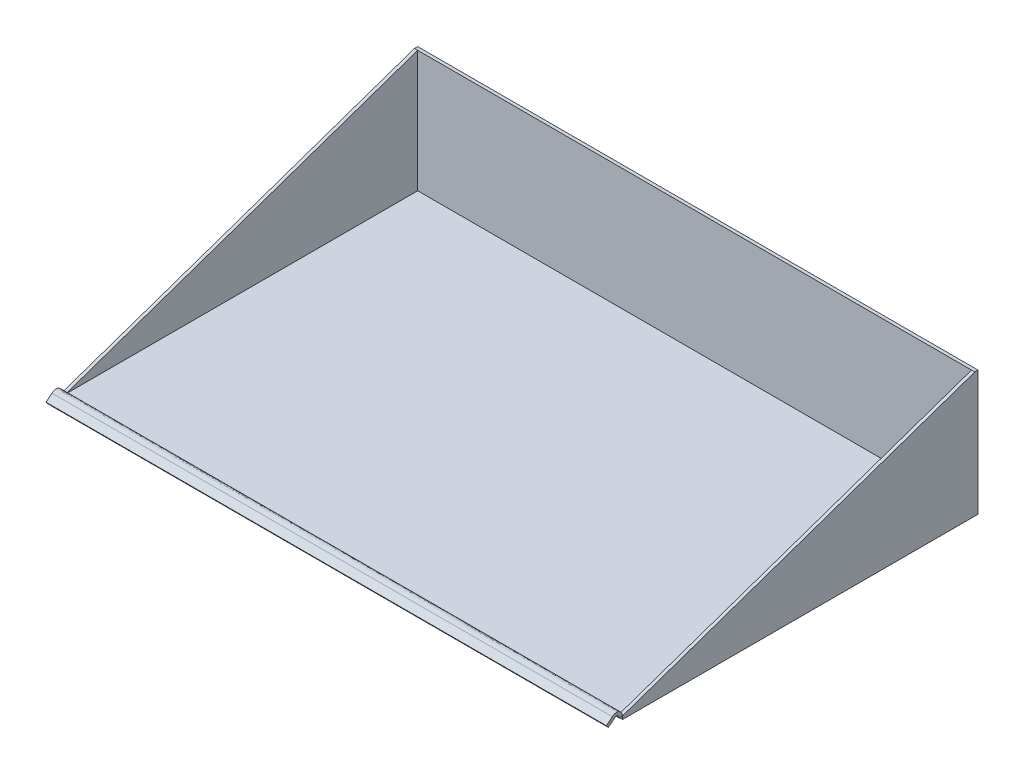
ISO-10303-21;
HEADER;
FILE_DESCRIPTION(('STEP AP214'),'2;1');
FILE_NAME('part.step','',(''),(''),'','','');
FILE_SCHEMA(('AUTOMOTIVE_DESIGN { 1 0 10303 214 1 1 1 1 }'));
ENDSEC;
DATA;
#1=APPLICATION_CONTEXT('core data for automotive mechanical design processes');
#2=APPLICATION_PROTOCOL_DEFINITION('international standard','automotive_design',2000,#1);
#3=PRODUCT_CONTEXT('',#1,'mechanical');
#4=PRODUCT('Part','Part','',(#3));
#5=PRODUCT_RELATED_PRODUCT_CATEGORY('part','',(#4));
#6=PRODUCT_DEFINITION_FORMATION('','',#4);
#7=PRODUCT_DEFINITION_CONTEXT('part definition',#1,'design');
#8=PRODUCT_DEFINITION('design','',#6,#7);
#9=PRODUCT_DEFINITION_SHAPE('','',#8);
#10=(LENGTH_UNIT() NAMED_UNIT(*) SI_UNIT(.MILLI.,.METRE.));
#11=(NAMED_UNIT(*) PLANE_ANGLE_UNIT() SI_UNIT($,.RADIAN.));
#12=(NAMED_UNIT(*) SI_UNIT($,.STERADIAN.) SOLID_ANGLE_UNIT());
#13=UNCERTAINTY_MEASURE_WITH_UNIT(LENGTH_MEASURE(1.E-05),#10,'distance_accuracy_value','');
#14=(GEOMETRIC_REPRESENTATION_CONTEXT(3) GLOBAL_UNCERTAINTY_ASSIGNED_CONTEXT((#13)) GLOBAL_UNIT_ASSIGNED_CONTEXT((#10,
#11,#12)) REPRESENTATION_CONTEXT('',''));
#15=CARTESIAN_POINT('',(0.,0.,0.));
#16=DIRECTION('',(0.,0.,1.));
#17=DIRECTION('',(1.,0.,0.));
#18=AXIS2_PLACEMENT_3D('',#15,#16,#17);
#19=CARTESIAN_POINT('',(874.999030268134,-186.553060223373,1119.87866407682));
#20=CARTESIAN_POINT('',(874.999030268134,-185.33767047569,1120.06973985977));
#21=CARTESIAN_POINT('',(874.999030268134,-184.188767651149,1120.3794168465));
#22=CARTESIAN_POINT('',(874.999030268134,-182.088320689779,1121.1802260065));
#23=CARTESIAN_POINT('',(874.999030268134,-181.137567773144,1121.67135685643));
#24=CARTESIAN_POINT('',(874.999030268134,-179.489339069219,1122.75910040641));
#25=CARTESIAN_POINT('',(874.999030268134,-178.792882476305,1123.35478820171));
#26=CARTESIAN_POINT('',(874.999030268134,-177.671721163025,1124.56585322124));
#27=CARTESIAN_POINT('',(874.999030268134,-177.246987467464,1125.17864895372));
#28=CARTESIAN_POINT('',(874.999030268134,-176.782949501282,1126.07897587323));
#29=CARTESIAN_POINT('',(874.999030268134,-176.656608706155,1126.3765701471));
#30=CARTESIAN_POINT('',(874.999030268134,-176.453314872512,1126.97256389413));
#31=CARTESIAN_POINT('',(874.999030268134,-176.37619538104,1127.27099206625));
#32=CARTESIAN_POINT('',(874.999030268134,-176.267470575038,1127.8831959906));
#33=CARTESIAN_POINT('',(874.999030268134,-176.235735175897,1128.19712639057));
#34=CARTESIAN_POINT('',(874.999030268134,-176.22237280719,1128.86101090105));
#35=CARTESIAN_POINT('',(874.999030268134,-176.240740952856,1129.21118582822));
#36=CARTESIAN_POINT('',(874.999030268134,-176.342967965615,1129.96841319844));
#37=CARTESIAN_POINT('',(874.999030268134,-176.426954175793,1130.37563359115));
#38=CARTESIAN_POINT('',(874.999030268134,-176.684670954285,1131.26169017919));
#39=CARTESIAN_POINT('',(874.999030268134,-176.858576959705,1131.74056755363));
#40=CARTESIAN_POINT('',(874.999030268134,-177.557226077684,1133.29255868625));
#41=CARTESIAN_POINT('',(874.999030268134,-178.261229014839,1134.48391313188));
#42=CARTESIAN_POINT('',(874.999030268134,-179.304280989804,1135.80511230017));
#43=B_SPLINE_CURVE_WITH_KNOTS('',3,(#19,#20,#21,#22,#23,#24,#25,#26,#27,#28,#29,#30,#31,#32,#33,
#34,#35,#36,#37,#38,#39,#40,#41,#42),.UNSPECIFIED.,.F.,.F.,(4,2,2,2,2,2,2,2,2,2,2,4),(0.,0.125,
0.25,0.375,0.499999999999999,0.562499999999999,0.624999999999999,0.687499999999999,
0.749999999999999,0.812499999999999,0.874999999999999,1.),.UNSPECIFIED.);
#44=DIRECTION('',(-1.,0.,0.));
#45=VECTOR('',#44,1.);
#46=SURFACE_OF_LINEAR_EXTRUSION('',#43,#45);
#47=DIRECTION('',(-1.,0.,0.));
#48=VECTOR('',#47,1.);
#49=CARTESIAN_POINT('',(874.999030268134,-179.304280989804,1135.80511230017));
#50=LINE('',#49,#48);
#51=CARTESIAN_POINT('',(874.999030268134,-179.304280989804,1135.80511230017));
#52=VERTEX_POINT('',#51);
#53=CARTESIAN_POINT('',(-875.,-179.304280989804,1135.80511230017));
#54=VERTEX_POINT('',#53);
#55=EDGE_CURVE('E47',#52,#54,#50,.T.);
#56=ORIENTED_EDGE('',*,*,#55,.T.);
#57=CARTESIAN_POINT('',(-875.,-186.553060223373,1119.87866407682));
#58=CARTESIAN_POINT('',(-875.,-185.33767047569,1120.06973985977));
#59=CARTESIAN_POINT('',(-875.,-184.188767651149,1120.3794168465));
#60=CARTESIAN_POINT('',(-875.,-182.088320689779,1121.1802260065));
#61=CARTESIAN_POINT('',(-875.,-181.137567773144,1121.67135685643));
#62=CARTESIAN_POINT('',(-875.,-179.489339069219,1122.75910040641));
#63=CARTESIAN_POINT('',(-875.,-178.792882476305,1123.35478820171));
#64=CARTESIAN_POINT('',(-875.,-177.671721163025,1124.56585322124));
#65=CARTESIAN_POINT('',(-875.,-177.246987467464,1125.17864895372));
#66=CARTESIAN_POINT('',(-875.,-176.782949501282,1126.07897587323));
#67=CARTESIAN_POINT('',(-875.,-176.656608706155,1126.3765701471));
#68=CARTESIAN_POINT('',(-875.,-176.453314872512,1126.97256389413));
#69=CARTESIAN_POINT('',(-875.,-176.37619538104,1127.27099206625));
#70=CARTESIAN_POINT('',(-875.,-176.267470575038,1127.8831959906));
#71=CARTESIAN_POINT('',(-875.,-176.235735175897,1128.19712639057));
#72=CARTESIAN_POINT('',(-875.,-176.22237280719,1128.86101090105));
#73=CARTESIAN_POINT('',(-875.,-176.240740952856,1129.21118582822));
#74=CARTESIAN_POINT('',(-875.,-176.342967965615,1129.96841319844));
#75=CARTESIAN_POINT('',(-875.,-176.426954175793,1130.37563359115));
#76=CARTESIAN_POINT('',(-875.,-176.684670954285,1131.26169017919));
#77=CARTESIAN_POINT('',(-875.,-176.858576959705,1131.74056755363));
#78=CARTESIAN_POINT('',(-875.,-177.557226077684,1133.29255868625));
#79=CARTESIAN_POINT('',(-875.,-178.261229014839,1134.48391313188));
#80=CARTESIAN_POINT('',(-875.,-179.304280989804,1135.80511230017));
#81=B_SPLINE_CURVE_WITH_KNOTS('',3,(#57,#58,#59,#60,#61,#62,#63,#64,#65,#66,#67,#68,#69,#70,#71,
#72,#73,#74,#75,#76,#77,#78,#79,#80),.UNSPECIFIED.,.F.,.F.,(4,2,2,2,2,2,2,2,2,2,2,4),(0.,0.125,
0.25,0.375,0.499999999999999,0.562499999999999,0.624999999999999,0.687499999999999,
0.749999999999999,0.812499999999999,0.874999999999999,1.),.UNSPECIFIED.);
#82=CARTESIAN_POINT('',(-875.,-186.553060223373,1119.87866407682));
#83=VERTEX_POINT('',#82);
#84=EDGE_CURVE('E121',#83,#54,#81,.T.);
#85=ORIENTED_EDGE('',*,*,#84,.F.);
#86=DIRECTION('',(-1.,0.,0.));
#87=VECTOR('',#86,1.);
#88=CARTESIAN_POINT('',(874.999030268134,-186.553060223373,1119.87866407682));
#89=LINE('',#88,#87);
#90=CARTESIAN_POINT('',(874.999030268134,-186.553060223373,1119.87866407682));
#91=VERTEX_POINT('',#90);
#92=EDGE_CURVE('E12',#91,#83,#89,.T.);
#93=ORIENTED_EDGE('',*,*,#92,.F.);
#94=EDGE_CURVE('E142',#91,#52,#43,.T.);
#95=ORIENTED_EDGE('',*,*,#94,.T.);
#96=EDGE_LOOP('',(#56,#85,#93,#95));
#97=FACE_BOUND('',#96,.T.);
#98=ADVANCED_FACE('F43',(#97),#46,.T.);
#99=CARTESIAN_POINT('',(874.999030268134,-186.553060223373,1119.87866407682));
#100=DIRECTION('',(0.,0.987866407681604,0.155306022337329));
#101=DIRECTION('',(0.,-0.155306022337329,0.987866407681604));
#102=AXIS2_PLACEMENT_3D('',#99,#100,#101);
#103=PLANE('',#102);
#104=ORIENTED_EDGE('',*,*,#92,.T.);
#105=DIRECTION('',(0.,0.155306022337329,-0.987866407681604));
#106=VECTOR('',#105,1.);
#107=CARTESIAN_POINT('',(-875.,-186.553060223373,1119.87866407682));
#108=LINE('',#107,#106);
#109=CARTESIAN_POINT('',(-875.,-185.,1110.));
#110=VERTEX_POINT('',#109);
#111=EDGE_CURVE('E137',#83,#110,#108,.T.);
#112=ORIENTED_EDGE('',*,*,#111,.T.);
#113=DIRECTION('',(-1.,0.,0.));
#114=VECTOR('',#113,1.);
#115=CARTESIAN_POINT('',(874.999030268134,-185.,1110.));
#116=LINE('',#115,#114);
#117=CARTESIAN_POINT('',(874.999030268134,-185.,1110.));
#118=VERTEX_POINT('',#117);
#119=EDGE_CURVE('E52',#118,#110,#116,.T.);
#120=ORIENTED_EDGE('',*,*,#119,.F.);
#121=DIRECTION('',(0.,0.155306022337329,-0.987866407681604));
#122=VECTOR('',#121,1.);
#123=CARTESIAN_POINT('',(874.999030268134,-186.553060223373,1119.87866407682));
#124=LINE('',#123,#122);
#125=EDGE_CURVE('E65',#91,#118,#124,.T.);
#126=ORIENTED_EDGE('',*,*,#125,.F.);
#127=EDGE_LOOP('',(#104,#112,#120,#126));
#128=FACE_BOUND('',#127,.T.);
#129=ADVANCED_FACE('F162',(#128),#103,.F.);
#130=CARTESIAN_POINT('',(874.999030268134,-185.,1110.));
#131=CARTESIAN_POINT('',(874.999030268134,-169.848941356738,1112.38195229009));
#132=CARTESIAN_POINT('',(874.999030268134,-159.462762779071,1126.81081381579));
#133=CARTESIAN_POINT('',(874.999030268134,-171.45545333447,1142.00155518596));
#134=B_SPLINE_CURVE_WITH_KNOTS('',3,(#130,#131,#132,#133),.UNSPECIFIED.,.F.,.F.,(4,4),(0.,1.),.UNSPECIFIED.);
#135=DIRECTION('',(-1.,0.,0.));
#136=VECTOR('',#135,1.);
#137=SURFACE_OF_LINEAR_EXTRUSION('',#134,#136);
#138=ORIENTED_EDGE('',*,*,#119,.T.);
#139=CARTESIAN_POINT('',(-875.,-185.,1110.));
#140=CARTESIAN_POINT('',(-875.,-169.848941356738,1112.38195229009));
#141=CARTESIAN_POINT('',(-875.,-159.462762779071,1126.81081381579));
#142=CARTESIAN_POINT('',(-875.,-171.45545333447,1142.00155518596));
#143=B_SPLINE_CURVE_WITH_KNOTS('',3,(#139,#140,#141,#142),.UNSPECIFIED.,.F.,.F.,(4,4),(0.,1.),.UNSPECIFIED.);
#144=CARTESIAN_POINT('',(-875.,-171.45545333447,1142.00155518596));
#145=VERTEX_POINT('',#144);
#146=EDGE_CURVE('E123',#110,#145,#143,.T.);
#147=ORIENTED_EDGE('',*,*,#146,.T.);
#148=DIRECTION('',(-1.,0.,0.));
#149=VECTOR('',#148,1.);
#150=CARTESIAN_POINT('',(874.999030268134,-171.45545333447,1142.00155518596));
#151=LINE('',#150,#149);
#152=CARTESIAN_POINT('',(874.999030268134,-171.45545333447,1142.00155518596));
#153=VERTEX_POINT('',#152);
#154=EDGE_CURVE('E120',#153,#145,#151,.T.);
#155=ORIENTED_EDGE('',*,*,#154,.F.);
#156=EDGE_CURVE('E147',#118,#153,#134,.T.);
#157=ORIENTED_EDGE('',*,*,#156,.F.);
#158=EDGE_LOOP('',(#138,#147,#155,#157));
#159=FACE_BOUND('',#158,.T.);
#160=ADVANCED_FACE('F158',(#159),#137,.F.);
#161=CARTESIAN_POINT('',(874.999030268134,-176.937628823343,1125.77886690006));
#162=DIRECTION('',(-1.,0.,0.));
#163=DIRECTION('',(0.,0.,1.));
#164=AXIS2_PLACEMENT_3D('',#161,#162,#163);
#165=PLANE('',#164);
#166=ORIENTED_EDGE('',*,*,#94,.F.);
#167=ORIENTED_EDGE('',*,*,#125,.T.);
#168=ORIENTED_EDGE('',*,*,#156,.T.);
#169=DIRECTION('',(0.,0.619644288579017,-0.784882765533429));
#170=VECTOR('',#169,1.);
#171=CARTESIAN_POINT('',(874.999030268134,-186.35472510417,1160.87396609425));
#172=LINE('',#171,#170);
#173=CARTESIAN_POINT('',(874.999030268134,-186.35472510417,1160.87396609425));
#174=VERTEX_POINT('',#173);
#175=EDGE_CURVE('E189',#174,#153,#172,.T.);
#176=ORIENTED_EDGE('',*,*,#175,.F.);
#177=DIRECTION('',(0.,0.784882765533431,0.619644288579015));
#178=VECTOR('',#177,1.);
#179=CARTESIAN_POINT('',(874.999030268134,-194.203552759504,1154.67752320846));
#180=LINE('',#179,#178);
#181=CARTESIAN_POINT('',(874.999030268134,-194.203552759504,1154.67752320846));
#182=VERTEX_POINT('',#181);
#183=EDGE_CURVE('E113',#182,#174,#180,.T.);
#184=ORIENTED_EDGE('',*,*,#183,.F.);
#185=DIRECTION('',(0.,0.619644288579017,-0.784882765533429));
#186=VECTOR('',#185,1.);
#187=CARTESIAN_POINT('',(874.999030268134,-194.203552759504,1154.67752320846));
#188=LINE('',#187,#186);
#189=EDGE_CURVE('E125',#182,#52,#188,.T.);
#190=ORIENTED_EDGE('',*,*,#189,.T.);
#191=EDGE_LOOP('',(#166,#167,#168,#176,#184,#190));
#192=FACE_BOUND('',#191,.T.);
#193=ADVANCED_FACE('F161',(#192),#165,.F.);
#194=CARTESIAN_POINT('',(-875.,-176.937628823343,1125.77886690006));
#195=DIRECTION('',(-1.,0.,0.));
#196=DIRECTION('',(0.,0.,1.));
#197=AXIS2_PLACEMENT_3D('',#194,#195,#196);
#198=PLANE('',#197);
#199=ORIENTED_EDGE('',*,*,#84,.T.);
#200=DIRECTION('',(0.,0.619644288579017,-0.784882765533429));
#201=VECTOR('',#200,1.);
#202=CARTESIAN_POINT('',(-875.,-194.203552759504,1154.67752320846));
#203=LINE('',#202,#201);
#204=CARTESIAN_POINT('',(-875.,-194.203552759504,1154.67752320846));
#205=VERTEX_POINT('',#204);
#206=EDGE_CURVE('E104',#205,#54,#203,.T.);
#207=ORIENTED_EDGE('',*,*,#206,.F.);
#208=DIRECTION('',(0.,-0.784882765533431,-0.619644288579015));
#209=VECTOR('',#208,1.);
#210=CARTESIAN_POINT('',(-875.,-186.35472510417,1160.87396609425));
#211=LINE('',#210,#209);
#212=CARTESIAN_POINT('',(-875.,-186.35472510417,1160.87396609425));
#213=VERTEX_POINT('',#212);
#214=EDGE_CURVE('E96',#213,#205,#211,.T.);
#215=ORIENTED_EDGE('',*,*,#214,.F.);
#216=DIRECTION('',(0.,0.619644288579017,-0.784882765533429));
#217=VECTOR('',#216,1.);
#218=CARTESIAN_POINT('',(-875.,-186.35472510417,1160.87396609425));
#219=LINE('',#218,#217);
#220=EDGE_CURVE('E101',#213,#145,#219,.T.);
#221=ORIENTED_EDGE('',*,*,#220,.T.);
#222=ORIENTED_EDGE('',*,*,#146,.F.);
#223=ORIENTED_EDGE('',*,*,#111,.F.);
#224=EDGE_LOOP('',(#199,#207,#215,#221,#222,#223));
#225=FACE_BOUND('',#224,.T.);
#226=ADVANCED_FACE('F98',(#225),#198,.T.);
#227=CARTESIAN_POINT('',(874.999030268134,-186.35472510417,1160.87396609425));
#228=DIRECTION('',(0.,-0.784882765533429,-0.619644288579017));
#229=DIRECTION('',(0.,0.619644288579017,-0.784882765533429));
#230=AXIS2_PLACEMENT_3D('',#227,#228,#229);
#231=PLANE('',#230);
#232=ORIENTED_EDGE('',*,*,#154,.T.);
#233=ORIENTED_EDGE('',*,*,#220,.F.);
#234=DIRECTION('',(-1.,0.,0.));
#235=VECTOR('',#234,1.);
#236=CARTESIAN_POINT('',(874.999030268134,-186.35472510417,1160.87396609425));
#237=LINE('',#236,#235);
#238=EDGE_CURVE('E108',#174,#213,#237,.T.);
#239=ORIENTED_EDGE('',*,*,#238,.F.);
#240=ORIENTED_EDGE('',*,*,#175,.T.);
#241=EDGE_LOOP('',(#232,#233,#239,#240));
#242=FACE_BOUND('',#241,.T.);
#243=ADVANCED_FACE('F118',(#242),#231,.F.);
#244=CARTESIAN_POINT('',(-875.,-194.203552759504,1154.67752320846));
#245=DIRECTION('',(0.,0.784882765533429,0.619644288579017));
#246=DIRECTION('',(0.,-0.619644288579017,0.784882765533429));
#247=AXIS2_PLACEMENT_3D('',#244,#245,#246);
#248=PLANE('',#247);
#249=ORIENTED_EDGE('',*,*,#55,.F.);
#250=ORIENTED_EDGE('',*,*,#189,.F.);
#251=DIRECTION('',(1.,0.,0.));
#252=VECTOR('',#251,1.);
#253=CARTESIAN_POINT('',(-875.,-194.203552759504,1154.67752320846));
#254=LINE('',#253,#252);
#255=EDGE_CURVE('E107',#205,#182,#254,.T.);
#256=ORIENTED_EDGE('',*,*,#255,.F.);
#257=ORIENTED_EDGE('',*,*,#206,.T.);
#258=EDGE_LOOP('',(#249,#250,#256,#257));
#259=FACE_BOUND('',#258,.T.);
#260=ADVANCED_FACE('F173',(#259),#248,.F.);
#261=CARTESIAN_POINT('',(0.,-636.14145645955,805.779178182109));
#262=DIRECTION('',(0.,-0.619644288579015,0.784882765533431));
#263=DIRECTION('',(0.,-0.784882765533431,-0.619644288579015));
#264=AXIS2_PLACEMENT_3D('',#261,#262,#263);
#265=PLANE('',#264);
#266=ORIENTED_EDGE('',*,*,#238,.T.);
#267=ORIENTED_EDGE('',*,*,#214,.T.);
#268=ORIENTED_EDGE('',*,*,#255,.T.);
#269=ORIENTED_EDGE('',*,*,#183,.T.);
#270=EDGE_LOOP('',(#266,#267,#268,#269));
#271=FACE_BOUND('',#270,.T.);
#272=ADVANCED_FACE('F111',(#271),#265,.T.);
#273=CLOSED_SHELL('',(#98,#129,#160,#193,#226,#243,#260,#272));
#274=MANIFOLD_SOLID_BREP('B2',#273);
#275=CARTESIAN_POINT('',(-865.,-195.,10.));
#276=DIRECTION('',(0.,1.,0.));
#277=DIRECTION('',(0.,0.,1.));
#278=AXIS2_PLACEMENT_3D('',#275,#276,#277);
#279=PLANE('',#278);
#280=DIRECTION('',(1.,0.,0.));
#281=VECTOR('',#280,1.);
#282=CARTESIAN_POINT('',(-865.,-195.,0.));
#283=LINE('',#282,#281);
#284=CARTESIAN_POINT('',(-875.,-195.,0.));
#285=VERTEX_POINT('',#284);
#286=CARTESIAN_POINT('',(875.,-195.,0.));
#287=VERTEX_POINT('',#286);
#288=EDGE_CURVE('E380',#285,#287,#283,.T.);
#289=ORIENTED_EDGE('',*,*,#288,.T.);
#290=DIRECTION('',(0.,0.,-1.));
#291=VECTOR('',#290,1.);
#292=CARTESIAN_POINT('',(875.,-195.,0.));
#293=LINE('',#292,#291);
#294=CARTESIAN_POINT('',(875.,-195.,1110.));
#295=VERTEX_POINT('',#294);
#296=EDGE_CURVE('E354',#295,#287,#293,.T.);
#297=ORIENTED_EDGE('',*,*,#296,.F.);
#298=DIRECTION('',(1.,0.,0.));
#299=VECTOR('',#298,1.);
#300=CARTESIAN_POINT('',(-865.,-195.,1110.));
#301=LINE('',#300,#299);
#302=CARTESIAN_POINT('',(-875.,-195.,1110.));
#303=VERTEX_POINT('',#302);
#304=EDGE_CURVE('E371',#303,#295,#301,.T.);
#305=ORIENTED_EDGE('',*,*,#304,.F.);
#306=DIRECTION('',(0.,0.,-1.));
#307=VECTOR('',#306,1.);
#308=CARTESIAN_POINT('',(-875.,-195.,0.));
#309=LINE('',#308,#307);
#310=EDGE_CURVE('E336',#303,#285,#309,.T.);
#311=ORIENTED_EDGE('',*,*,#310,.T.);
#312=EDGE_LOOP('',(#289,#297,#305,#311));
#313=FACE_BOUND('',#312,.T.);
#314=ADVANCED_FACE('F247',(#313),#279,.F.);
#315=CARTESIAN_POINT('',(-865.,195.,10.));
#316=DIRECTION('',(0.,-1.,0.));
#317=DIRECTION('',(0.,0.,-1.));
#318=AXIS2_PLACEMENT_3D('',#315,#316,#317);
#319=PLANE('',#318);
#320=DIRECTION('',(-1.,0.,0.));
#321=VECTOR('',#320,1.);
#322=CARTESIAN_POINT('',(-865.,195.,0.));
#323=LINE('',#322,#321);
#324=CARTESIAN_POINT('',(875.,195.,0.));
#325=VERTEX_POINT('',#324);
#326=CARTESIAN_POINT('',(-875.,195.,0.));
#327=VERTEX_POINT('',#326);
#328=EDGE_CURVE('E250',#325,#327,#323,.T.);
#329=ORIENTED_EDGE('',*,*,#328,.T.);
#330=DIRECTION('',(0.,0.,1.));
#331=VECTOR('',#330,1.);
#332=CARTESIAN_POINT('',(-875.,195.,10.));
#333=LINE('',#332,#331);
#334=CARTESIAN_POINT('',(-875.,195.,10.));
#335=VERTEX_POINT('',#334);
#336=EDGE_CURVE('E341',#327,#335,#333,.T.);
#337=ORIENTED_EDGE('',*,*,#336,.T.);
#338=DIRECTION('',(1.,0.,0.));
#339=VECTOR('',#338,1.);
#340=CARTESIAN_POINT('',(-875.,195.,10.));
#341=LINE('',#340,#339);
#342=CARTESIAN_POINT('',(-865.,195.,10.));
#343=VERTEX_POINT('',#342);
#344=EDGE_CURVE('E326',#335,#343,#341,.T.);
#345=ORIENTED_EDGE('',*,*,#344,.T.);
#346=DIRECTION('',(-1.,0.,0.));
#347=VECTOR('',#346,1.);
#348=CARTESIAN_POINT('',(-865.,195.,10.));
#349=LINE('',#348,#347);
#350=CARTESIAN_POINT('',(865.,195.,10.));
#351=VERTEX_POINT('',#350);
#352=EDGE_CURVE('E41',#351,#343,#349,.T.);
#353=ORIENTED_EDGE('',*,*,#352,.F.);
#354=DIRECTION('',(-1.,0.,0.));
#355=VECTOR('',#354,1.);
#356=CARTESIAN_POINT('',(875.,195.,10.));
#357=LINE('',#356,#355);
#358=CARTESIAN_POINT('',(875.,195.,10.));
#359=VERTEX_POINT('',#358);
#360=EDGE_CURVE('E368',#359,#351,#357,.T.);
#361=ORIENTED_EDGE('',*,*,#360,.F.);
#362=DIRECTION('',(0.,0.,1.));
#363=VECTOR('',#362,1.);
#364=CARTESIAN_POINT('',(875.,195.,10.));
#365=LINE('',#364,#363);
#366=EDGE_CURVE('E360',#325,#359,#365,.T.);
#367=ORIENTED_EDGE('',*,*,#366,.F.);
#368=EDGE_LOOP('',(#329,#337,#345,#353,#361,#367));
#369=FACE_BOUND('',#368,.T.);
#370=ADVANCED_FACE('F387',(#369),#319,.F.);
#371=CARTESIAN_POINT('',(0.,0.,10.));
#372=DIRECTION('',(0.,0.,1.));
#373=DIRECTION('',(1.,0.,0.));
#374=AXIS2_PLACEMENT_3D('',#371,#372,#373);
#375=PLANE('',#374);
#376=DIRECTION('',(-1.,0.,0.));
#377=VECTOR('',#376,1.);
#378=CARTESIAN_POINT('',(-865.,-185.,10.));
#379=LINE('',#378,#377);
#380=CARTESIAN_POINT('',(865.,-185.,10.));
#381=VERTEX_POINT('',#380);
#382=CARTESIAN_POINT('',(-865.,-185.,10.));
#383=VERTEX_POINT('',#382);
#384=EDGE_CURVE('E370',#381,#383,#379,.T.);
#385=ORIENTED_EDGE('',*,*,#384,.F.);
#386=DIRECTION('',(0.,1.,0.));
#387=VECTOR('',#386,1.);
#388=CARTESIAN_POINT('',(865.,195.,10.));
#389=LINE('',#388,#387);
#390=EDGE_CURVE('E255',#381,#351,#389,.T.);
#391=ORIENTED_EDGE('',*,*,#390,.T.);
#392=ORIENTED_EDGE('',*,*,#352,.T.);
#393=DIRECTION('',(0.,-1.,0.));
#394=VECTOR('',#393,1.);
#395=CARTESIAN_POINT('',(-865.,195.,10.));
#396=LINE('',#395,#394);
#397=EDGE_CURVE('E381',#343,#383,#396,.T.);
#398=ORIENTED_EDGE('',*,*,#397,.T.);
#399=EDGE_LOOP('',(#385,#391,#392,#398));
#400=FACE_BOUND('',#399,.T.);
#401=ADVANCED_FACE('F401',(#400),#375,.T.);
#402=CARTESIAN_POINT('',(0.,0.,0.));
#403=DIRECTION('',(0.,0.,1.));
#404=DIRECTION('',(1.,0.,0.));
#405=AXIS2_PLACEMENT_3D('',#402,#403,#404);
#406=PLANE('',#405);
#407=ORIENTED_EDGE('',*,*,#288,.F.);
#408=DIRECTION('',(0.,1.,0.));
#409=VECTOR('',#408,1.);
#410=CARTESIAN_POINT('',(-875.,195.,0.));
#411=LINE('',#410,#409);
#412=EDGE_CURVE('E343',#285,#327,#411,.T.);
#413=ORIENTED_EDGE('',*,*,#412,.T.);
#414=ORIENTED_EDGE('',*,*,#328,.F.);
#415=DIRECTION('',(0.,1.,0.));
#416=VECTOR('',#415,1.);
#417=CARTESIAN_POINT('',(875.,195.,0.));
#418=LINE('',#417,#416);
#419=EDGE_CURVE('E357',#287,#325,#418,.T.);
#420=ORIENTED_EDGE('',*,*,#419,.F.);
#421=EDGE_LOOP('',(#407,#413,#414,#420));
#422=FACE_BOUND('',#421,.T.);
#423=ADVANCED_FACE('F391',(#422),#406,.F.);
#424=CARTESIAN_POINT('',(-865.,-185.,1110.));
#425=DIRECTION('',(0.,-1.,0.));
#426=DIRECTION('',(0.,0.,-1.));
#427=AXIS2_PLACEMENT_3D('',#424,#425,#426);
#428=PLANE('',#427);
#429=ORIENTED_EDGE('',*,*,#384,.T.);
#430=DIRECTION('',(0.,0.,-1.));
#431=VECTOR('',#430,1.);
#432=CARTESIAN_POINT('',(-865.,-185.,1110.));
#433=LINE('',#432,#431);
#434=CARTESIAN_POINT('',(-865.,-185.,1110.));
#435=VERTEX_POINT('',#434);
#436=EDGE_CURVE('E270',#435,#383,#433,.T.);
#437=ORIENTED_EDGE('',*,*,#436,.F.);
#438=DIRECTION('',(-1.,0.,0.));
#439=VECTOR('',#438,1.);
#440=CARTESIAN_POINT('',(-865.,-185.,1110.));
#441=LINE('',#440,#439);
#442=CARTESIAN_POINT('',(865.,-185.,1110.));
#443=VERTEX_POINT('',#442);
#444=EDGE_CURVE('E321',#443,#435,#441,.T.);
#445=ORIENTED_EDGE('',*,*,#444,.F.);
#446=DIRECTION('',(0.,0.,-1.));
#447=VECTOR('',#446,1.);
#448=CARTESIAN_POINT('',(865.,-185.,1110.));
#449=LINE('',#448,#447);
#450=EDGE_CURVE('E377',#443,#381,#449,.T.);
#451=ORIENTED_EDGE('',*,*,#450,.T.);
#452=EDGE_LOOP('',(#429,#437,#445,#451));
#453=FACE_BOUND('',#452,.T.);
#454=ADVANCED_FACE('F399',(#453),#428,.F.);
#455=CARTESIAN_POINT('',(0.,0.,1110.));
#456=DIRECTION('',(0.,0.,-1.));
#457=DIRECTION('',(-1.,0.,0.));
#458=AXIS2_PLACEMENT_3D('',#455,#456,#457);
#459=PLANE('',#458);
#460=ORIENTED_EDGE('',*,*,#444,.T.);
#461=DIRECTION('',(1.,0.,0.));
#462=VECTOR('',#461,1.);
#463=CARTESIAN_POINT('',(-875.,-185.,1110.));
#464=LINE('',#463,#462);
#465=CARTESIAN_POINT('',(-875.,-185.,1110.));
#466=VERTEX_POINT('',#465);
#467=EDGE_CURVE('E314',#466,#435,#464,.T.);
#468=ORIENTED_EDGE('',*,*,#467,.F.);
#469=DIRECTION('',(0.,-1.,0.));
#470=VECTOR('',#469,1.);
#471=CARTESIAN_POINT('',(-875.,-195.,1110.));
#472=LINE('',#471,#470);
#473=EDGE_CURVE('E317',#466,#303,#472,.T.);
#474=ORIENTED_EDGE('',*,*,#473,.T.);
#475=ORIENTED_EDGE('',*,*,#304,.T.);
#476=DIRECTION('',(0.,-1.,0.));
#477=VECTOR('',#476,1.);
#478=CARTESIAN_POINT('',(875.,-195.,1110.));
#479=LINE('',#478,#477);
#480=CARTESIAN_POINT('',(875.,-185.,1110.));
#481=VERTEX_POINT('',#480);
#482=EDGE_CURVE('E351',#481,#295,#479,.T.);
#483=ORIENTED_EDGE('',*,*,#482,.F.);
#484=DIRECTION('',(-1.,0.,0.));
#485=VECTOR('',#484,1.);
#486=CARTESIAN_POINT('',(875.,-185.,1110.));
#487=LINE('',#486,#485);
#488=EDGE_CURVE('E364',#481,#443,#487,.T.);
#489=ORIENTED_EDGE('',*,*,#488,.T.);
#490=EDGE_LOOP('',(#460,#468,#474,#475,#483,#489));
#491=FACE_BOUND('',#490,.T.);
#492=ADVANCED_FACE('F316',(#491),#459,.F.);
#493=CARTESIAN_POINT('',(865.,0.,0.));
#494=DIRECTION('',(-1.,0.,0.));
#495=DIRECTION('',(0.,0.,1.));
#496=AXIS2_PLACEMENT_3D('',#493,#494,#495);
#497=PLANE('',#496);
#498=ORIENTED_EDGE('',*,*,#390,.F.);
#499=ORIENTED_EDGE('',*,*,#450,.F.);
#500=DIRECTION('',(0.,-0.326520252798047,0.945190205468031));
#501=VECTOR('',#500,1.);
#502=CARTESIAN_POINT('',(865.,-185.,1110.));
#503=LINE('',#502,#501);
#504=EDGE_CURVE('E325',#351,#443,#503,.T.);
#505=ORIENTED_EDGE('',*,*,#504,.F.);
#506=EDGE_LOOP('',(#498,#499,#505));
#507=FACE_BOUND('',#506,.T.);
#508=ADVANCED_FACE('F406',(#507),#497,.T.);
#509=CARTESIAN_POINT('',(875.,-185.,1110.));
#510=DIRECTION('',(0.,-0.945190205468031,-0.326520252798047));
#511=DIRECTION('',(0.,0.326520252798047,-0.945190205468031));
#512=AXIS2_PLACEMENT_3D('',#509,#510,#511);
#513=PLANE('',#512);
#514=ORIENTED_EDGE('',*,*,#504,.T.);
#515=ORIENTED_EDGE('',*,*,#488,.F.);
#516=DIRECTION('',(0.,-0.326520252798047,0.945190205468031));
#517=VECTOR('',#516,1.);
#518=CARTESIAN_POINT('',(875.,-185.,1110.));
#519=LINE('',#518,#517);
#520=EDGE_CURVE('E362',#359,#481,#519,.T.);
#521=ORIENTED_EDGE('',*,*,#520,.F.);
#522=ORIENTED_EDGE('',*,*,#360,.T.);
#523=EDGE_LOOP('',(#514,#515,#521,#522));
#524=FACE_BOUND('',#523,.T.);
#525=ADVANCED_FACE('F404',(#524),#513,.F.);
#526=CARTESIAN_POINT('',(875.,0.,0.));
#527=DIRECTION('',(-1.,0.,0.));
#528=DIRECTION('',(0.,0.,1.));
#529=AXIS2_PLACEMENT_3D('',#526,#527,#528);
#530=PLANE('',#529);
#531=ORIENTED_EDGE('',*,*,#482,.T.);
#532=ORIENTED_EDGE('',*,*,#296,.T.);
#533=ORIENTED_EDGE('',*,*,#419,.T.);
#534=ORIENTED_EDGE('',*,*,#366,.T.);
#535=ORIENTED_EDGE('',*,*,#520,.T.);
#536=EDGE_LOOP('',(#531,#532,#533,#534,#535));
#537=FACE_BOUND('',#536,.T.);
#538=ADVANCED_FACE('F393',(#537),#530,.F.);
#539=CARTESIAN_POINT('',(-875.,-185.,1110.));
#540=DIRECTION('',(0.,0.945190205468031,0.326520252798047));
#541=DIRECTION('',(0.,-0.326520252798047,0.945190205468031));
#542=AXIS2_PLACEMENT_3D('',#539,#540,#541);
#543=PLANE('',#542);
#544=DIRECTION('',(0.,-0.326520252798047,0.945190205468031));
#545=VECTOR('',#544,1.);
#546=CARTESIAN_POINT('',(-865.,-185.,1110.));
#547=LINE('',#546,#545);
#548=EDGE_CURVE('E337',#343,#435,#547,.T.);
#549=ORIENTED_EDGE('',*,*,#548,.F.);
#550=ORIENTED_EDGE('',*,*,#344,.F.);
#551=DIRECTION('',(0.,-0.326520252798047,0.945190205468031));
#552=VECTOR('',#551,1.);
#553=CARTESIAN_POINT('',(-875.,-185.,1110.));
#554=LINE('',#553,#552);
#555=EDGE_CURVE('E332',#335,#466,#554,.T.);
#556=ORIENTED_EDGE('',*,*,#555,.T.);
#557=ORIENTED_EDGE('',*,*,#467,.T.);
#558=EDGE_LOOP('',(#549,#550,#556,#557));
#559=FACE_BOUND('',#558,.T.);
#560=ADVANCED_FACE('F339',(#559),#543,.T.);
#561=CARTESIAN_POINT('',(-875.,0.,0.));
#562=DIRECTION('',(1.,0.,0.));
#563=DIRECTION('',(0.,0.,1.));
#564=AXIS2_PLACEMENT_3D('',#561,#562,#563);
#565=PLANE('',#564);
#566=ORIENTED_EDGE('',*,*,#473,.F.);
#567=ORIENTED_EDGE('',*,*,#555,.F.);
#568=ORIENTED_EDGE('',*,*,#336,.F.);
#569=ORIENTED_EDGE('',*,*,#412,.F.);
#570=ORIENTED_EDGE('',*,*,#310,.F.);
#571=EDGE_LOOP('',(#566,#567,#568,#569,#570));
#572=FACE_BOUND('',#571,.T.);
#573=ADVANCED_FACE('F330',(#572),#565,.F.);
#574=CARTESIAN_POINT('',(-865.,0.,0.));
#575=DIRECTION('',(1.,0.,0.));
#576=DIRECTION('',(0.,0.,1.));
#577=AXIS2_PLACEMENT_3D('',#574,#575,#576);
#578=PLANE('',#577);
#579=ORIENTED_EDGE('',*,*,#548,.T.);
#580=ORIENTED_EDGE('',*,*,#436,.T.);
#581=ORIENTED_EDGE('',*,*,#397,.F.);
#582=EDGE_LOOP('',(#579,#580,#581));
#583=FACE_BOUND('',#582,.T.);
#584=ADVANCED_FACE('F403',(#583),#578,.T.);
#585=CLOSED_SHELL('',(#314,#370,#401,#423,#454,#492,#508,#525,#538,#560,#573,#584));
#586=MANIFOLD_SOLID_BREP('B6',#585);
#587=ADVANCED_BREP_SHAPE_REPRESENTATION('',(#18,#274,#586),#14);
#588=SHAPE_DEFINITION_REPRESENTATION(#9,#587);
ENDSEC;
END-ISO-10303-21;
